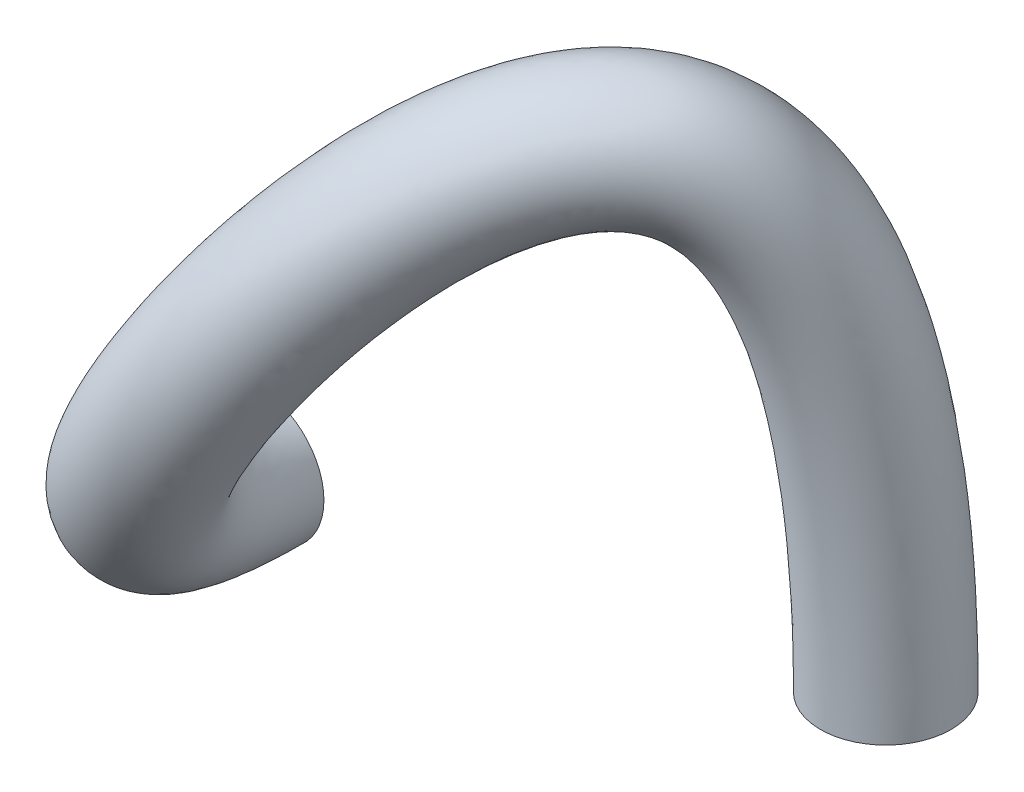
ISO-10303-21;
HEADER;
FILE_DESCRIPTION(('STEP AP214'),'2;1');
FILE_NAME('part.step','',(''),(''),'','','');
FILE_SCHEMA(('AUTOMOTIVE_DESIGN { 1 0 10303 214 1 1 1 1 }'));
ENDSEC;
DATA;
#1=APPLICATION_CONTEXT('core data for automotive mechanical design processes');
#2=APPLICATION_PROTOCOL_DEFINITION('international standard','automotive_design',2000,#1);
#3=PRODUCT_CONTEXT('',#1,'mechanical');
#4=PRODUCT('Part','Part','',(#3));
#5=PRODUCT_RELATED_PRODUCT_CATEGORY('part','',(#4));
#6=PRODUCT_DEFINITION_FORMATION('','',#4);
#7=PRODUCT_DEFINITION_CONTEXT('part definition',#1,'design');
#8=PRODUCT_DEFINITION('design','',#6,#7);
#9=PRODUCT_DEFINITION_SHAPE('','',#8);
#10=(LENGTH_UNIT() NAMED_UNIT(*) SI_UNIT(.MILLI.,.METRE.));
#11=(NAMED_UNIT(*) PLANE_ANGLE_UNIT() SI_UNIT($,.RADIAN.));
#12=(NAMED_UNIT(*) SI_UNIT($,.STERADIAN.) SOLID_ANGLE_UNIT());
#13=UNCERTAINTY_MEASURE_WITH_UNIT(LENGTH_MEASURE(1.E-05),#10,'distance_accuracy_value','');
#14=(GEOMETRIC_REPRESENTATION_CONTEXT(3) GLOBAL_UNCERTAINTY_ASSIGNED_CONTEXT((#13)) GLOBAL_UNIT_ASSIGNED_CONTEXT((#10,
#11,#12)) REPRESENTATION_CONTEXT('',''));
#15=CARTESIAN_POINT('',(0.,0.,0.));
#16=DIRECTION('',(0.,0.,1.));
#17=DIRECTION('',(1.,0.,0.));
#18=AXIS2_PLACEMENT_3D('',#15,#16,#17);
#19=CARTESIAN_POINT('',(9.5,-0.299999999999995,-2.49999999999999));
#20=DIRECTION('',(0.,-1.,0.));
#21=DIRECTION('',(0.435860668457198,0.,0.900014154162058));
#22=AXIS2_PLACEMENT_3D('',#19,#20,#21);
#23=PLANE('',#22);
#24=CARTESIAN_POINT('',(9.5,-0.299999999999995,-2.49999999999999));
#25=DIRECTION('',(0.,-1.,0.));
#26=DIRECTION('',(0.435860668457198,0.,0.900014154162058));
#27=AXIS2_PLACEMENT_3D('',#24,#25,#26);
#28=CIRCLE('',#27,1.);
#29=CARTESIAN_POINT('',(9.93586066845719,-0.299999999999995,-1.59998584583793));
#30=VERTEX_POINT('',#29);
#31=EDGE_CURVE('E373',#30,#30,#28,.T.);
#32=ORIENTED_EDGE('',*,*,#31,.F.);
#33=EDGE_LOOP('',(#32));
#34=FACE_BOUND('',#33,.T.);
#35=CARTESIAN_POINT('',(9.5,-0.299999999999995,-2.49999999999999));
#36=DIRECTION('',(0.,-1.,0.));
#37=DIRECTION('',(0.435860668457198,0.,0.900014154162058));
#38=AXIS2_PLACEMENT_3D('',#35,#36,#37);
#39=CIRCLE('',#38,1.25);
#40=CARTESIAN_POINT('',(10.0448258355715,-0.299999999999995,-1.37498230729742));
#41=VERTEX_POINT('',#40);
#42=EDGE_CURVE('E12',#41,#41,#39,.T.);
#43=ORIENTED_EDGE('',*,*,#42,.T.);
#44=EDGE_LOOP('',(#43));
#45=FACE_BOUND('',#44,.T.);
#46=ADVANCED_FACE('F363',(#34,#45),#23,.T.);
#47=CARTESIAN_POINT('',(0.,0.,0.));
#48=DIRECTION('',(0.,0.,1.));
#49=DIRECTION('',(1.,0.,0.));
#50=AXIS2_PLACEMENT_3D('',#47,#48,#49);
#51=PLANE('',#50);
#52=CARTESIAN_POINT('',(0.,0.,0.));
#53=DIRECTION('',(0.,0.,1.));
#54=DIRECTION('',(1.,0.,0.));
#55=AXIS2_PLACEMENT_3D('',#52,#53,#54);
#56=CIRCLE('',#55,1.);
#57=CARTESIAN_POINT('',(1.,0.,0.));
#58=VERTEX_POINT('',#57);
#59=EDGE_CURVE('E392',#58,#58,#56,.T.);
#60=ORIENTED_EDGE('',*,*,#59,.T.);
#61=EDGE_LOOP('',(#60));
#62=FACE_BOUND('',#61,.T.);
#63=CARTESIAN_POINT('',(0.,0.,0.));
#64=DIRECTION('',(0.,0.,1.));
#65=DIRECTION('',(1.,0.,0.));
#66=AXIS2_PLACEMENT_3D('',#63,#64,#65);
#67=CIRCLE('',#66,1.25);
#68=CARTESIAN_POINT('',(1.25,0.,0.));
#69=VERTEX_POINT('',#68);
#70=EDGE_CURVE('E396',#69,#69,#67,.T.);
#71=ORIENTED_EDGE('',*,*,#70,.F.);
#72=EDGE_LOOP('',(#71));
#73=FACE_BOUND('',#72,.T.);
#74=ADVANCED_FACE('F408',(#62,#73),#51,.F.);
#75=CARTESIAN_POINT('',(1.25,0.,0.));
#76=CARTESIAN_POINT('',(1.24970790337068,-0.00442970995162257,0.193780155677641));
#77=CARTESIAN_POINT('',(1.25956072183078,0.00909482461159728,0.558457921405644));
#78=CARTESIAN_POINT('',(1.29891196332282,0.0804809128516302,1.03069994944278));
#79=CARTESIAN_POINT('',(1.36104166953268,0.19771811780606,1.43692270584782));
#80=CARTESIAN_POINT('',(1.45279667691925,0.371767351783156,1.82348734922537));
#81=CARTESIAN_POINT('',(1.58195449858562,0.615163662315327,2.17950840450404));
#82=CARTESIAN_POINT('',(1.76016188263552,0.945262448393021,2.49952021703322));
#83=CARTESIAN_POINT('',(2.06956449123567,1.50538970272502,2.8675601946024));
#84=CARTESIAN_POINT('',(2.59305886805236,2.41443726349767,3.16848247234639));
#85=CARTESIAN_POINT('',(3.41104303123515,3.72714985596968,3.26574160593447));
#86=CARTESIAN_POINT('',(4.34120833536003,5.11241913369484,3.13949142073032));
#87=CARTESIAN_POINT('',(5.20299741193419,6.294117376404,2.83372957978067));
#88=CARTESIAN_POINT('',(5.94933645553859,7.18019723928193,2.42657665049239));
#89=CARTESIAN_POINT('',(6.57180688229958,7.78557086388303,2.0019254901733));
#90=CARTESIAN_POINT('',(7.11097395414223,8.15960166936673,1.5735169273491));
#91=CARTESIAN_POINT('',(7.56094060980183,8.33675642255061,1.18206758947252));
#92=CARTESIAN_POINT('',(7.92910186187369,8.36889366444584,0.842062655194875));
#93=CARTESIAN_POINT('',(8.26546278110174,8.27496931394701,0.516495861563007));
#94=CARTESIAN_POINT('',(8.5500861514691,8.06658416352015,0.230136076100738));
#95=CARTESIAN_POINT('',(8.79387600969797,7.76984274005819,-0.0217799630494153));
#96=CARTESIAN_POINT('',(8.99724077648749,7.42639308342426,-0.235859805852988));
#97=CARTESIAN_POINT('',(9.19205215628314,6.98450483040624,-0.444215783109933));
#98=CARTESIAN_POINT('',(9.37436994956392,6.43763013462569,-0.641840370690207));
#99=CARTESIAN_POINT('',(9.54056068354409,5.78084656498555,-0.823966280102341));
#100=CARTESIAN_POINT('',(9.75401471178737,4.66114827118732,-1.05984110455954));
#101=CARTESIAN_POINT('',(9.96368412396966,2.81651578889666,-1.29356368532677));
#102=CARTESIAN_POINT('',(10.0369369317042,0.821620233164514,-1.37136536985113));
#103=CARTESIAN_POINT('',(10.0448258355715,-0.3,-1.37498230729743));
#104=CARTESIAN_POINT('',(1.25,-2.5,0.));
#105=CARTESIAN_POINT('',(1.24326949411234,-2.50181298777697,0.284465678298547));
#106=CARTESIAN_POINT('',(1.24024549405577,-2.48305500886445,0.830514489268459));
#107=CARTESIAN_POINT('',(1.28164878753975,-2.35640521686806,1.6210350533056));
#108=CARTESIAN_POINT('',(1.36906171119503,-2.13356525191951,2.36444589003704));
#109=CARTESIAN_POINT('',(1.51887264374403,-1.77764712323755,3.12459053171646));
#110=CARTESIAN_POINT('',(1.74561876096536,-1.26108228048667,3.84848541086706));
#111=CARTESIAN_POINT('',(2.04870855327784,-0.586881492411512,4.47080149910897));
#112=CARTESIAN_POINT('',(2.52263876041138,0.458696762098314,5.12297275854536));
#113=CARTESIAN_POINT('',(3.17450532447572,1.90543280817112,5.56959339553539));
#114=CARTESIAN_POINT('',(3.96286188998503,3.76392804037613,5.72406069441622));
#115=CARTESIAN_POINT('',(4.71806872609749,5.69481341765327,5.56561120964543));
#116=CARTESIAN_POINT('',(5.40553546389612,7.35308661426771,5.10666251364441));
#117=CARTESIAN_POINT('',(6.09693283040277,8.61964756213019,4.4769121236844));
#118=CARTESIAN_POINT('',(6.77673204213036,9.52591798254483,3.80128221697133));
#119=CARTESIAN_POINT('',(7.49582689240253,10.1483627689428,3.0642558034562));
#120=CARTESIAN_POINT('',(8.23478754397491,10.4912127661881,2.29483573104287));
#121=CARTESIAN_POINT('',(8.95791275933525,10.5687596752776,1.52951764450363));
#122=CARTESIAN_POINT('',(9.69554480530046,10.3479044223534,0.731030365550332));
#123=CARTESIAN_POINT('',(10.2929809327123,9.87381572726062,0.0650102769275119));
#124=CARTESIAN_POINT('',(10.7391660034103,9.29484067579996,-0.446464611738695));
#125=CARTESIAN_POINT('',(11.0679515064167,8.70553872313428,-0.832611018337669));
#126=CARTESIAN_POINT('',(11.3477292432485,8.0324778252559,-1.1697592436317));
#127=CARTESIAN_POINT('',(11.5845110661343,7.27815232036638,-1.46290919809448));
#128=CARTESIAN_POINT('',(11.7834520850161,6.43960342234825,-1.71643643009938));
#129=CARTESIAN_POINT('',(12.022466051904,5.09156416509547,-2.03102124779668));
#130=CARTESIAN_POINT('',(12.2343562822196,3.01274304166662,-2.33166525625266));
#131=CARTESIAN_POINT('',(12.293851241391,0.88702931742117,-2.44383367425509));
#132=CARTESIAN_POINT('',(12.2948612209766,-0.299999999999999,-2.46463397844042));
#133=CARTESIAN_POINT('',(-1.25,-2.5,0.));
#134=CARTESIAN_POINT('',(-1.25614631262901,-2.49295356787373,0.326472590329619));
#135=CARTESIAN_POINT('',(-1.2580019261683,-2.45647674915471,0.956535225361718));
#136=CARTESIAN_POINT('',(-1.20430341974557,-2.2806331228024,1.89035039885427));
#137=CARTESIAN_POINT('',(-1.09340096136642,-1.98497698885241,2.78183892657522));
#138=CARTESIAN_POINT('',(-0.903139167127545,-1.5181289196593,3.70028500158813));
#139=CARTESIAN_POINT('',(-0.61580000183354,-0.846044031622846,4.56957072846409));
#140=CARTESIAN_POINT('',(-0.237728493246647,0.0174508212094394,5.29076025993228));
#141=CARTESIAN_POINT('',(0.336970471299427,1.32513626669239,5.99212656325895));
#142=CARTESIAN_POINT('',(1.08035231005068,3.051951199913,6.33867970603329));
#143=CARTESIAN_POINT('',(1.90298858081161,5.12931816943711,6.17575927204351));
#144=CARTESIAN_POINT('',(2.66184987031994,7.14700845506247,5.54379138629021));
#145=CARTESIAN_POINT('',(3.38437492957966,8.76559304408309,4.63536138141749));
#146=CARTESIAN_POINT('',(4.1447320872943,9.96955947334087,3.6763040881749));
#147=CARTESIAN_POINT('',(4.91030943963567,10.8325561739908,2.76230762640708));
#148=CARTESIAN_POINT('',(5.74219410862505,11.4344874324561,1.82340426154238));
#149=CARTESIAN_POINT('',(6.62410722921302,11.756528039735,0.854665361810865));
#150=CARTESIAN_POINT('',(7.50877833528575,11.7849662320469,-0.112946290087902));
#151=CARTESIAN_POINT('',(8.42092112297979,11.4501137790389,-1.12396891402562));
#152=CARTESIAN_POINT('',(9.14761331727424,10.8148738789513,-1.95253356086149));
#153=CARTESIAN_POINT('',(9.67106953957135,10.0785013702174,-2.56871918784365));
#154=CARTESIAN_POINT('',(10.0424290645541,9.35649176576981,-3.01922999948148));
#155=CARTESIAN_POINT('',(10.3450613751276,8.56101247156933,-3.39914912104568));
#156=CARTESIAN_POINT('',(10.5899622781176,7.69828990542811,-3.71853824029694));
#157=CARTESIAN_POINT('',(10.7866573845945,6.76584653026602,-3.98635421162122));
#158=CARTESIAN_POINT('',(11.0121399616626,5.30123805146396,-4.30940390010062));
#159=CARTESIAN_POINT('',(11.1920380342803,3.10556465895813,-4.60340226633559));
#160=CARTESIAN_POINT('',(11.2199773779825,0.91796985651834,-4.70110293455283));
#161=CARTESIAN_POINT('',(11.2052095498336,-0.299999999999999,-4.71466936384557));
#162=CARTESIAN_POINT('',(-1.25,0.,0.));
#163=CARTESIAN_POINT('',(-1.24970790337068,0.0044297099516227,0.235787067708713));
#164=CARTESIAN_POINT('',(-1.23868669839329,0.0356730843213421,0.684478657498903));
#165=CARTESIAN_POINT('',(-1.1870402439625,0.156253006917288,1.30001529499145));
#166=CARTESIAN_POINT('',(-1.10142100302877,0.346306380873162,1.854315742386));
#167=CARTESIAN_POINT('',(-0.969215133952324,0.631285555361405,2.39918181909705));
#168=CARTESIAN_POINT('',(-0.779464264213283,1.03020191117915,2.90059372210108));
#169=CARTESIAN_POINT('',(-0.526275163888964,1.54959476201397,3.31947897785652));
#170=CARTESIAN_POINT('',(-0.116103797876289,2.3718292073191,3.73671399931599));
#171=CARTESIAN_POINT('',(0.498905853627324,3.56095565523954,3.93756878284429));
#172=CARTESIAN_POINT('',(1.35116972206173,5.09253998503065,3.71744018356176));
#173=CARTESIAN_POINT('',(2.28498947958248,6.56461417110404,3.11767159737511));
#174=CARTESIAN_POINT('',(3.18183687761773,7.70662380621938,2.36242844755375));
#175=CARTESIAN_POINT('',(3.99713571243011,8.53010915049262,1.62596861498288));
#176=CARTESIAN_POINT('',(4.70538427980489,9.09220905532896,0.962950899609052));
#177=CARTESIAN_POINT('',(5.35734117036475,9.4457263328801,0.332665385435285));
#178=CARTESIAN_POINT('',(5.95026029503994,9.6020716960975,-0.258102779759483));
#179=CARTESIAN_POINT('',(6.47996743782418,9.5851002212151,-0.800401279396655));
#180=CARTESIAN_POINT('',(6.99083909878106,9.37717867063252,-1.33850341801294));
#181=CARTESIAN_POINT('',(7.40471853603101,9.00764231521084,-1.78740776168826));
#182=CARTESIAN_POINT('',(7.72577954585897,8.55350343447563,-2.14403453915437));
#183=CARTESIAN_POINT('',(7.97171833462486,8.07734612605979,-2.4224787869968));
#184=CARTESIAN_POINT('',(8.18938428816229,7.51303947671967,-2.67360566052391));
#185=CARTESIAN_POINT('',(8.37982116154719,6.85776771968743,-2.89746941289267));
#186=CARTESIAN_POINT('',(8.54376598312256,6.10708967290333,-3.09388406162418));
#187=CARTESIAN_POINT('',(8.74368862154596,4.8708221575558,-3.33822375686348));
#188=CARTESIAN_POINT('',(8.92136587603032,2.90933740618817,-3.5653006954097));
#189=CARTESIAN_POINT('',(8.96306306829577,0.852560772261685,-3.62863463014887));
#190=CARTESIAN_POINT('',(8.9551741644285,-0.3,-3.62501769270257));
#191=CARTESIAN_POINT('',(-1.25,2.5,0.));
#192=CARTESIAN_POINT('',(-1.24326949411234,2.50181298777697,0.145101545087806));
#193=CARTESIAN_POINT('',(-1.21937147061828,2.52782291779739,0.412422089636088));
#194=CARTESIAN_POINT('',(-1.16977706817943,2.59313913663698,0.709680191128635));
#195=CARTESIAN_POINT('',(-1.10944104469112,2.67758975059873,0.92679255819678));
#196=CARTESIAN_POINT('',(-1.0352911007771,2.78070003038211,1.09807863660596));
#197=CARTESIAN_POINT('',(-0.943128526593025,2.90644785398115,1.23161671573806));
#198=CARTESIAN_POINT('',(-0.814821834531281,3.0817387028185,1.34819769578077));
#199=CARTESIAN_POINT('',(-0.569178067052006,3.4185221479458,1.48130143537304));
#200=CARTESIAN_POINT('',(-0.0825406027960343,4.06996011056609,1.5364578596553));
#201=CARTESIAN_POINT('',(0.799350863311849,5.0557618006242,1.25912109508));
#202=CARTESIAN_POINT('',(1.90812908884503,5.98221988714561,0.691551808460004));
#203=CARTESIAN_POINT('',(2.9792988256558,6.64765456835566,0.089495513690001));
#204=CARTESIAN_POINT('',(3.84953933756593,7.09065882764436,-0.42436685820914));
#205=CARTESIAN_POINT('',(4.50045911997411,7.35186193666715,-0.836405827188979));
#206=CARTESIAN_POINT('',(4.97248823210444,7.45696523330408,-1.15807349067181));
#207=CARTESIAN_POINT('',(5.27641336086687,7.44761535246002,-1.37087092132983));
#208=CARTESIAN_POINT('',(5.45115654036262,7.38523421038333,-1.48785626870541));
#209=CARTESIAN_POINT('',(5.56075707458234,7.30424356222608,-1.55303792200026));
#210=CARTESIAN_POINT('',(5.66182375478778,7.20041075147037,-1.62228196251504));
#211=CARTESIAN_POINT('',(5.7804895521466,7.02850549873386,-1.71934989046509));
#212=CARTESIAN_POINT('',(5.90100760469561,6.79820048634977,-1.82572757451212));
#213=CARTESIAN_POINT('',(6.03370720119694,6.46506648187,-1.94806220000214));
#214=CARTESIAN_POINT('',(6.16968004497683,6.01724553394675,-2.07640058548839));
#215=CARTESIAN_POINT('',(6.30087458165058,5.44833281554063,-2.20141391162714));
#216=CARTESIAN_POINT('',(6.47523728142937,4.44040626364765,-2.36704361362634));
#217=CARTESIAN_POINT('',(6.65069371778037,2.71311015341821,-2.52719912448382));
#218=CARTESIAN_POINT('',(6.70614875860903,0.78715168800503,-2.55616632574491));
#219=CARTESIAN_POINT('',(6.70513877902336,-0.300000000000001,-2.53536602155958));
#220=CARTESIAN_POINT('',(1.25,2.5,0.));
#221=CARTESIAN_POINT('',(1.25614631262901,2.49295356787373,0.103094633056735));
#222=CARTESIAN_POINT('',(1.27887594960579,2.50124465808764,0.286401353542829));
#223=CARTESIAN_POINT('',(1.31617513910589,2.51736704257132,0.440364845579962));
#224=CARTESIAN_POINT('',(1.35302162787033,2.52900148753163,0.509399521658595));
#225=CARTESIAN_POINT('',(1.38672071009447,2.52118182680386,0.522384166734286));
#226=CARTESIAN_POINT('',(1.41829023620588,2.49140960511733,0.510531398141029));
#227=CARTESIAN_POINT('',(1.4716152119932,2.47740638919755,0.528238934957466));
#228=CARTESIAN_POINT('',(1.61649022205995,2.55208264335172,0.612147630659443));
#229=CARTESIAN_POINT('',(2.011612411629,2.92344171882421,0.767371549157393));
#230=CARTESIAN_POINT('',(2.85922417248527,3.69037167156322,0.807422517452712));
#231=CARTESIAN_POINT('',(3.96434794462259,4.53002484973641,0.713371631815217));
#232=CARTESIAN_POINT('',(5.00045935997226,5.23514813854028,0.560796645916925));
#233=CARTESIAN_POINT('',(5.80174008067441,5.74074691643368,0.376241177300366));
#234=CARTESIAN_POINT('',(6.3668817224688,6.04522374522122,0.202568763375268));
#235=CARTESIAN_POINT('',(6.72612101588192,6.17084056979072,0.0827780512420079));
#236=CARTESIAN_POINT('',(6.88709367562875,6.18230007891313,0.0692994479021747));
#237=CARTESIAN_POINT('',(6.90029096441212,6.16902765361408,0.154607665886122));
#238=CARTESIAN_POINT('',(6.83538075690301,6.20203420554057,0.301961357575683));
#239=CARTESIAN_POINT('',(6.80719137022587,6.25935259977967,0.395261875273965));
#240=CARTESIAN_POINT('',(6.84858601598559,6.24484480431642,0.402904685639865));
#241=CARTESIAN_POINT('',(6.92653004655825,6.14724744371423,0.360891406631692));
#242=CARTESIAN_POINT('',(7.03637506931779,5.93653183555657,0.281327677411837));
#243=CARTESIAN_POINT('',(7.16422883299355,5.59710794888501,0.179228456714067));
#244=CARTESIAN_POINT('',(7.29766928207211,5.12208970762285,0.0685038698946952));
#245=CARTESIAN_POINT('',(7.48556337167078,4.23073237727916,-0.0886609613223963));
#246=CARTESIAN_POINT('',(7.69301196571971,2.6202885361267,-0.255462114400884));
#247=CARTESIAN_POINT('',(7.78002262201747,0.75621114890786,-0.29889706544717));
#248=CARTESIAN_POINT('',(7.79479045016635,-0.300000000000001,-0.285330636154433));
#249=CARTESIAN_POINT('',(1.25,0.,0.));
#250=CARTESIAN_POINT('',(1.24970790337068,-0.00442970995162257,0.193780155677641));
#251=CARTESIAN_POINT('',(1.25956072183078,0.00909482461159728,0.558457921405644));
#252=CARTESIAN_POINT('',(1.29891196332282,0.0804809128516302,1.03069994944278));
#253=CARTESIAN_POINT('',(1.36104166953268,0.19771811780606,1.43692270584782));
#254=CARTESIAN_POINT('',(1.45279667691925,0.371767351783156,1.82348734922537));
#255=CARTESIAN_POINT('',(1.58195449858562,0.615163662315327,2.17950840450404));
#256=CARTESIAN_POINT('',(1.76016188263552,0.945262448393021,2.49952021703322));
#257=CARTESIAN_POINT('',(2.06956449123567,1.50538970272502,2.8675601946024));
#258=CARTESIAN_POINT('',(2.59305886805236,2.41443726349767,3.16848247234639));
#259=CARTESIAN_POINT('',(3.41104303123515,3.72714985596968,3.26574160593447));
#260=CARTESIAN_POINT('',(4.34120833536003,5.11241913369484,3.13949142073032));
#261=CARTESIAN_POINT('',(5.20299741193419,6.294117376404,2.83372957978067));
#262=CARTESIAN_POINT('',(5.94933645553859,7.18019723928193,2.42657665049239));
#263=CARTESIAN_POINT('',(6.57180688229958,7.78557086388303,2.0019254901733));
#264=CARTESIAN_POINT('',(7.11097395414223,8.15960166936673,1.5735169273491));
#265=CARTESIAN_POINT('',(7.56094060980183,8.33675642255061,1.18206758947252));
#266=CARTESIAN_POINT('',(7.92910186187369,8.36889366444584,0.842062655194875));
#267=CARTESIAN_POINT('',(8.26546278110174,8.27496931394701,0.516495861563007));
#268=CARTESIAN_POINT('',(8.5500861514691,8.06658416352015,0.230136076100738));
#269=CARTESIAN_POINT('',(8.79387600969797,7.76984274005819,-0.0217799630494153));
#270=CARTESIAN_POINT('',(8.99724077648749,7.42639308342426,-0.235859805852988));
#271=CARTESIAN_POINT('',(9.19205215628314,6.98450483040624,-0.444215783109933));
#272=CARTESIAN_POINT('',(9.37436994956392,6.43763013462569,-0.641840370690207));
#273=CARTESIAN_POINT('',(9.54056068354409,5.78084656498555,-0.823966280102341));
#274=CARTESIAN_POINT('',(9.75401471178737,4.66114827118732,-1.05984110455954));
#275=CARTESIAN_POINT('',(9.96368412396966,2.81651578889666,-1.29356368532677));
#276=CARTESIAN_POINT('',(10.0369369317042,0.821620233164514,-1.37136536985113));
#277=CARTESIAN_POINT('',(10.0448258355715,-0.3,-1.37498230729743));
#278=(BOUNDED_SURFACE() B_SPLINE_SURFACE(3,3,((#75,#76,#77,#78,#79,#80,#81,#82,#83,#84,#85,#86,
#87,#88,#89,#90,#91,#92,#93,#94,#95,#96,#97,#98,#99,#100,#101,#102,#103),(#104,#105,#106,#107,
#108,#109,#110,#111,#112,#113,#114,#115,#116,#117,#118,#119,#120,#121,#122,#123,#124,#125,#126,
#127,#128,#129,#130,#131,#132),(#133,#134,#135,#136,#137,#138,#139,#140,#141,#142,#143,#144,
#145,#146,#147,#148,#149,#150,#151,#152,#153,#154,#155,#156,#157,#158,#159,#160,#161),(#162,
#163,#164,#165,#166,#167,#168,#169,#170,#171,#172,#173,#174,#175,#176,#177,#178,#179,#180,#181,
#182,#183,#184,#185,#186,#187,#188,#189,#190),(#191,#192,#193,#194,#195,#196,#197,#198,#199,
#200,#201,#202,#203,#204,#205,#206,#207,#208,#209,#210,#211,#212,#213,#214,#215,#216,#217,#218,
#219),(#220,#221,#222,#223,#224,#225,#226,#227,#228,#229,#230,#231,#232,#233,#234,#235,#236,
#237,#238,#239,#240,#241,#242,#243,#244,#245,#246,#247,#248),(#249,#250,#251,#252,#253,#254,
#255,#256,#257,#258,#259,#260,#261,#262,#263,#264,#265,#266,#267,#268,#269,#270,#271,#272,#273,
#274,#275,#276,#277)),.UNSPECIFIED.,.T.,.F.,.F.) B_SPLINE_SURFACE_WITH_KNOTS((4,3,4),(4,1,1,1,1,
1,1,1,1,1,1,1,1,1,1,1,1,1,1,1,1,1,1,1,1,1,4),(0.,0.5,1.),(0.,0.0234374999999876,0.046875,
0.0703125,0.09375,0.124999999999364,0.156250000000001,0.1875,0.2578125,0.328125,
0.398437500000124,0.468749999999996,0.515625,0.5625,0.609374999999483,0.64453125,0.6796875,
0.71484375,0.75,0.773333333333349,0.796666666666853,0.82,0.843333333333333,0.866666666666667,
0.89,0.945,1.),.UNSPECIFIED.) GEOMETRIC_REPRESENTATION_ITEM() RATIONAL_B_SPLINE_SURFACE(((1.,1.,
1.,1.,1.,1.,1.,1.,1.,1.,1.,1.,1.,1.,1.,1.,1.,1.,1.,1.,1.,1.,1.,1.,1.,1.,1.,1.,1.),
(0.333333333333333,0.333333333333333,0.333333333333333,0.333333333333333,0.333333333333333,
0.333333333333333,0.333333333333333,0.333333333333333,0.333333333333333,0.333333333333333,
0.333333333333333,0.333333333333333,0.333333333333333,0.333333333333333,0.333333333333333,
0.333333333333333,0.333333333333334,0.333333333333333,0.333333333333333,0.333333333333333,
0.333333333333333,0.333333333333333,0.333333333333333,0.333333333333333,0.333333333333333,
0.333333333333333,0.333333333333333,0.333333333333333,0.333333333333333),(0.333333333333333,
0.333333333333333,0.333333333333333,0.333333333333333,0.333333333333333,0.333333333333333,
0.333333333333333,0.333333333333333,0.333333333333333,0.333333333333333,0.333333333333333,
0.333333333333333,0.333333333333333,0.333333333333333,0.333333333333333,0.333333333333333,
0.333333333333334,0.333333333333333,0.333333333333333,0.333333333333333,0.333333333333333,
0.333333333333333,0.333333333333333,0.333333333333333,0.333333333333333,0.333333333333333,
0.333333333333333,0.333333333333333,0.333333333333333),(1.,1.,1.,1.,1.,1.,1.,1.,1.,1.,1.,1.,1.,
1.,1.,1.,1.,1.,1.,1.,1.,1.,1.,1.,1.,1.,1.,1.,1.),(0.333333333333333,0.333333333333333,
0.333333333333333,0.333333333333333,0.333333333333333,0.333333333333333,0.333333333333333,
0.333333333333333,0.333333333333333,0.333333333333333,0.333333333333333,0.333333333333333,
0.333333333333333,0.333333333333333,0.333333333333333,0.333333333333333,0.333333333333334,
0.333333333333333,0.333333333333333,0.333333333333333,0.333333333333333,0.333333333333333,
0.333333333333333,0.333333333333333,0.333333333333333,0.333333333333333,0.333333333333333,
0.333333333333333,0.333333333333333),(0.333333333333333,0.333333333333333,0.333333333333333,
0.333333333333333,0.333333333333333,0.333333333333333,0.333333333333333,0.333333333333333,
0.333333333333333,0.333333333333333,0.333333333333333,0.333333333333333,0.333333333333333,
0.333333333333333,0.333333333333333,0.333333333333333,0.333333333333334,0.333333333333333,
0.333333333333333,0.333333333333333,0.333333333333333,0.333333333333333,0.333333333333333,
0.333333333333333,0.333333333333333,0.333333333333333,0.333333333333333,0.333333333333333,
0.333333333333333),(1.,1.,1.,1.,1.,1.,1.,1.,1.,1.,1.,1.,1.,1.,1.,1.,1.,1.,1.,1.,1.,1.,1.,1.,1.,
1.,1.,1.,1.))) REPRESENTATION_ITEM('') SURFACE());
#279=CARTESIAN_POINT('',(1.25,0.,0.));
#280=CARTESIAN_POINT('',(1.24970790337068,-0.00442970995162257,0.193780155677641));
#281=CARTESIAN_POINT('',(1.25956072183078,0.00909482461159728,0.558457921405644));
#282=CARTESIAN_POINT('',(1.29891196332282,0.0804809128516302,1.03069994944278));
#283=CARTESIAN_POINT('',(1.36104166953268,0.19771811780606,1.43692270584782));
#284=CARTESIAN_POINT('',(1.45279667691925,0.371767351783156,1.82348734922537));
#285=CARTESIAN_POINT('',(1.58195449858562,0.615163662315327,2.17950840450404));
#286=CARTESIAN_POINT('',(1.76016188263552,0.945262448393021,2.49952021703322));
#287=CARTESIAN_POINT('',(2.06956449123567,1.50538970272502,2.8675601946024));
#288=CARTESIAN_POINT('',(2.59305886805236,2.41443726349767,3.16848247234639));
#289=CARTESIAN_POINT('',(3.41104303123515,3.72714985596968,3.26574160593447));
#290=CARTESIAN_POINT('',(4.34120833536003,5.11241913369484,3.13949142073032));
#291=CARTESIAN_POINT('',(5.20299741193419,6.294117376404,2.83372957978067));
#292=CARTESIAN_POINT('',(5.94933645553859,7.18019723928193,2.42657665049239));
#293=CARTESIAN_POINT('',(6.57180688229958,7.78557086388303,2.0019254901733));
#294=CARTESIAN_POINT('',(7.11097395414223,8.15960166936673,1.5735169273491));
#295=CARTESIAN_POINT('',(7.56094060980183,8.33675642255061,1.18206758947252));
#296=CARTESIAN_POINT('',(7.92910186187369,8.36889366444584,0.842062655194875));
#297=CARTESIAN_POINT('',(8.26546278110174,8.27496931394701,0.516495861563007));
#298=CARTESIAN_POINT('',(8.5500861514691,8.06658416352015,0.230136076100738));
#299=CARTESIAN_POINT('',(8.79387600969797,7.76984274005819,-0.0217799630494153));
#300=CARTESIAN_POINT('',(8.99724077648749,7.42639308342426,-0.235859805852988));
#301=CARTESIAN_POINT('',(9.19205215628314,6.98450483040624,-0.444215783109933));
#302=CARTESIAN_POINT('',(9.37436994956392,6.43763013462569,-0.641840370690207));
#303=CARTESIAN_POINT('',(9.54056068354409,5.78084656498555,-0.823966280102341));
#304=CARTESIAN_POINT('',(9.75401471178737,4.66114827118732,-1.05984110455954));
#305=CARTESIAN_POINT('',(9.96368412396966,2.81651578889666,-1.29356368532677));
#306=CARTESIAN_POINT('',(10.0369369317042,0.821620233164514,-1.37136536985113));
#307=CARTESIAN_POINT('',(10.0448258355715,-0.3,-1.37498230729743));
#308=B_SPLINE_CURVE_WITH_KNOTS('',3,(#279,#280,#281,#282,#283,#284,#285,#286,#287,#288,#289,
#290,#291,#292,#293,#294,#295,#296,#297,#298,#299,#300,#301,#302,#303,#304,#305,#306,#307),
.UNSPECIFIED.,.F.,.F.,(4,1,1,1,1,1,1,1,1,1,1,1,1,1,1,1,1,1,1,1,1,1,1,1,1,1,4),(0.,
0.0234374999999876,0.046875,0.0703125,0.09375,0.124999999999364,0.156250000000001,0.1875,
0.2578125,0.328125,0.398437500000124,0.468749999999996,0.515625,0.5625,0.609374999999483,
0.64453125,0.6796875,0.71484375,0.75,0.773333333333349,0.796666666666853,0.82,0.843333333333333,
0.866666666666667,0.89,0.945,1.),.UNSPECIFIED.);
#309=EDGE_CURVE('E366',#69,#41,#308,.T.);
#310=ORIENTED_EDGE('',*,*,#70,.T.);
#311=ORIENTED_EDGE('',*,*,#309,.T.);
#312=ORIENTED_EDGE('',*,*,#42,.F.);
#313=ORIENTED_EDGE('',*,*,#309,.F.);
#314=EDGE_LOOP('',(#310,#311,#312,#313));
#315=FACE_BOUND('',#314,.T.);
#316=ADVANCED_FACE('F406',(#315),#278,.F.);
#317=CARTESIAN_POINT('',(1.,0.,0.));
#318=CARTESIAN_POINT('',(0.999766322696543,-0.00354376796129806,0.197980846880748));
#319=CARTESIAN_POINT('',(1.00973597980837,0.0117526505825718,0.57105999501497));
#320=CARTESIAN_POINT('',(1.05031674259429,0.0880581222581959,1.05763148399765));
#321=CARTESIAN_POINT('',(1.11479540227653,0.21257694411277,1.47866200950164));
#322=CARTESIAN_POINT('',(1.21059549583209,0.397719172140981,1.88105679621254));
#323=CARTESIAN_POINT('',(1.34581262230573,0.656667487201709,2.25161693626375));
#324=CARTESIAN_POINT('',(1.53151817798307,1.00569567975512,2.58151609311555));
#325=CARTESIAN_POINT('',(1.85099766232447,1.59203365318443,2.95447557507376));
#326=CARTESIAN_POINT('',(2.38364356660986,2.52908910267185,3.24539110339618));
#327=CARTESIAN_POINT('',(3.20505570031781,3.86368886887578,3.31091146369719));
#328=CARTESIAN_POINT('',(4.13558644978228,5.25763863743576,3.1373094383948));
#329=CARTESIAN_POINT('',(5.00088135850254,6.43536801938554,2.78659946655798));
#330=CARTESIAN_POINT('',(5.75411638122774,7.315188430403,2.34651584694143));
#331=CARTESIAN_POINT('',(6.38516462205011,7.91623468302762,1.89802803111687));
#332=CARTESIAN_POINT('',(6.93561067576448,8.28821413571807,1.44943177315772));
#333=CARTESIAN_POINT('',(7.39987257832564,8.4632879499053,1.03805055254932));
#334=CARTESIAN_POINT('',(7.78418841946874,8.49051432012277,0.677816261735722));
#335=CARTESIAN_POINT('',(8.13800041286967,8.38519024961556,0.330995933605413));
#336=CARTESIAN_POINT('',(8.43554938992529,8.16068997868921,0.0283816923218383));
#337=CARTESIAN_POINT('',(8.68706636331407,7.84820880949994,-0.234005420659911));
#338=CARTESIAN_POINT('',(8.89468853230123,7.49148838768781,-0.454521703967369));
#339=CARTESIAN_POINT('',(9.09178536947105,7.03735829503758,-0.667154770851331));
#340=CARTESIAN_POINT('',(9.27491507076224,6.47964389313186,-0.867403274910453));
#341=CARTESIAN_POINT('',(9.44088121350194,5.81347087577733,-1.05095805825453));
#342=CARTESIAN_POINT('',(9.65298210276323,4.68211565982417,-1.28767936978993));
#343=CARTESIAN_POINT('',(9.85945229917573,2.82579795062581,-1.52073738633507));
#344=CARTESIAN_POINT('',(9.92954954536337,0.824714287074231,-1.5970922958809));
#345=CARTESIAN_POINT('',(9.9358606684572,-0.3,-1.59998584583794));
#346=CARTESIAN_POINT('',(1.,-2.,0.));
#347=CARTESIAN_POINT('',(0.994615595289875,-2.00145039022158,0.270529264977473));
#348=CARTESIAN_POINT('',(0.994283797588363,-1.98196721619827,0.788705249305222));
#349=CARTESIAN_POINT('',(1.03650620196783,-1.86145078151755,1.5298995670879));
#350=CARTESIAN_POINT('',(1.12121143560641,-1.65244975166769,2.22068055685301));
#351=CARTESIAN_POINT('',(1.26345626929192,-1.32181240787558,2.92193934220541));
#352=CARTESIAN_POINT('',(1.47674403220952,-0.84432926703989,3.58679854135416));
#353=CARTESIAN_POINT('',(1.76235551449693,-0.22001947288851,4.15854111877615));
#354=CARTESIAN_POINT('',(2.21345707766504,0.754679300683063,4.75880562622812));
#355=CARTESIAN_POINT('',(2.84880073174854,2.12188553841062,5.16627984194738));
#356=CARTESIAN_POINT('',(3.64651078731771,3.89311141640094,5.2775667344826));
#357=CARTESIAN_POINT('',(4.43707476237224,5.7235540646025,5.07820526952688));
#358=CARTESIAN_POINT('',(5.16291180007209,7.28254340967651,4.60494581364897));
#359=CARTESIAN_POINT('',(5.87219348111909,8.4667486886816,3.98678422549505));
#360=CARTESIAN_POINT('',(6.54910474991474,9.30851237795706,3.3375134125553));
#361=CARTESIAN_POINT('',(7.24349302637272,9.87922301537889,2.6420228740434));
#362=CARTESIAN_POINT('',(7.9389501256641,10.1868530248153,1.9282650658056));
#363=CARTESIAN_POINT('',(8.60723713743799,10.2504071287882,1.22778025318272));
#364=CARTESIAN_POINT('',(9.28206603222865,10.0435383363407,0.502623536795272));
#365=CARTESIAN_POINT('',(9.82986521491987,9.6064752296816,-0.103718947016743));
#366=CARTESIAN_POINT('',(10.243298358284,9.06820715809335,-0.573753139611335));
#367=CARTESIAN_POINT('',(10.5512571162446,8.51480489945583,-0.931922673955114));
#368=CARTESIAN_POINT('',(10.8163270390433,7.87573669091731,-1.24758953926875));
#369=CARTESIAN_POINT('',(11.0430279640185,7.15206164172441,-1.52425833683387));
#370=CARTESIAN_POINT('',(11.2351943346795,6.34047636166748,-1.76493417825216));
#371=CARTESIAN_POINT('',(11.4677431748565,5.02644837495069,-2.06462348437965));
#372=CARTESIAN_POINT('',(11.6759900257757,2.98277975284178,-2.35121864307578));
#373=CARTESIAN_POINT('',(11.7350809931128,0.877041554479555,-2.45506693940407));
#374=CARTESIAN_POINT('',(11.7358889767813,-0.299999999999999,-2.47170718275234));
#375=CARTESIAN_POINT('',(-1.,-2.,0.));
#376=CARTESIAN_POINT('',(-1.00491705010321,-1.99436285429898,0.304134794602331));
#377=CARTESIAN_POINT('',(-1.00431413859089,-1.96070460843047,0.889521838179829));
#378=CARTESIAN_POINT('',(-0.952255563860423,-1.80083310626503,1.74535184352684));
#379=CARTESIAN_POINT('',(-0.848758702442748,-1.533579141214,2.55459498608356));
#380=CARTESIAN_POINT('',(-0.674153179405343,-1.11419784501298,3.38249491810275));
#381=CARTESIAN_POINT('',(-0.412390978029599,-0.512298667948829,4.16366679543178));
#382=CARTESIAN_POINT('',(-0.0667941227226616,0.263446378008251,4.8145081274348));
#383=CARTESIAN_POINT('',(0.46492244637548,1.44783090435833,5.454128669999));
#384=CARTESIAN_POINT('',(1.17347832020851,3.03910025180412,5.7815488903457));
#385=CARTESIAN_POINT('',(1.99861213997897,4.98542351964972,5.63892559658443));
#386=CARTESIAN_POINT('',(2.7920996777502,6.88531009452986,5.06074941084271));
#387=CARTESIAN_POINT('',(3.54598337261892,8.4125485535288,4.22790490786743));
#388=CARTESIAN_POINT('',(4.31043288663231,9.54667821765015,3.34629779708744));
#389=CARTESIAN_POINT('',(5.05596666791898,10.3538229311138,2.5063337401039));
#390=CARTESIAN_POINT('',(5.84058679935074,10.9081227461896,1.64934164051234));
#391=CARTESIAN_POINT('',(6.65040587385459,11.1991052436528,0.776128770419996));
#392=CARTESIAN_POINT('',(7.44792959819839,11.2233723742036,-0.0861908944904995));
#393=CARTESIAN_POINT('',(8.26236708637211,10.9253058216891,-0.981375886865485));
#394=CARTESIAN_POINT('',(8.9135711225694,10.3593217510342,-1.71775401724794));
#395=CARTESIAN_POINT('',(9.38882118721278,9.6951357136273,-2.2715568004953));
#396=CARTESIAN_POINT('',(9.73083916275451,9.03556733356426,-2.68121785887016));
#397=CARTESIAN_POINT('',(10.0141927445467,8.29856440796806,-3.03110144119993));
#398=CARTESIAN_POINT('',(10.2473889336052,7.4881717097738,-3.32876157059584));
#399=CARTESIAN_POINT('',(10.4377585743423,6.60147084800171,-3.58086840346963));
#400=CARTESIAN_POINT('',(10.6594823026634,5.19418748404548,-3.8873296062228));
#401=CARTESIAN_POINT('',(10.8421354274242,3.05703704667499,-4.16860825114212));
#402=CARTESIAN_POINT('',(10.875981902386,0.901793985757291,-4.26088234764226));
#403=CARTESIAN_POINT('',(10.8641676398669,-0.299999999999999,-4.27173549107645));
#404=CARTESIAN_POINT('',(-1.,0.,0.));
#405=CARTESIAN_POINT('',(-0.999766322696543,0.00354376796129816,0.231586376505605));
#406=CARTESIAN_POINT('',(-0.988861956370884,0.0330152583503677,0.671876583889577));
#407=CARTESIAN_POINT('',(-0.938445023233965,0.148675797510722,1.27308376043659));
#408=CARTESIAN_POINT('',(-0.855174735772628,0.331447554566452,1.81257643873218));
#409=CARTESIAN_POINT('',(-0.727013952865166,0.60533373500358,2.34161237210988));
#410=CARTESIAN_POINT('',(-0.543322387933393,0.98869808629277,2.82848519034137));
#411=CARTESIAN_POINT('',(-0.297631459236515,1.48916153065188,3.23748310177419));
#412=CARTESIAN_POINT('',(0.102463031034906,2.28518525685969,3.64979861884464));
#413=CARTESIAN_POINT('',(0.708321155069828,3.44630381606536,3.8606601517945));
#414=CARTESIAN_POINT('',(1.55715705297907,4.95600097212455,3.67227032579903));
#415=CARTESIAN_POINT('',(2.49061136516024,6.41939466736312,3.11985357971063));
#416=CARTESIAN_POINT('',(3.38395293104938,7.56537316323784,2.40955856077644));
#417=CARTESIAN_POINT('',(4.19235578674096,8.39511795937155,1.70602941853383));
#418=CARTESIAN_POINT('',(4.89202654005436,8.96154523618436,1.06684835866548));
#419=CARTESIAN_POINT('',(5.53270444874249,9.31711386652877,0.456750539626667));
#420=CARTESIAN_POINT('',(6.11132832651613,9.47554016874281,-0.114085742836282));
#421=CARTESIAN_POINT('',(6.62488088022914,9.46347956553817,-0.636154885937502));
#422=CARTESIAN_POINT('',(7.11830146701313,9.26695773496396,-1.15300349005534));
#423=CARTESIAN_POINT('',(7.51925529757482,8.91353650004177,-1.58565337790936));
#424=CARTESIAN_POINT('',(7.83258919224287,8.47513736503389,-1.93180908154388));
#425=CARTESIAN_POINT('',(8.07427057881112,8.01225082179624,-2.20381688888242));
#426=CARTESIAN_POINT('',(8.28965107497437,7.46018601208833,-2.45066667278251));
#427=CARTESIAN_POINT('',(8.47927604034886,6.81575396118125,-2.67190650867242));
#428=CARTESIAN_POINT('',(8.64344545316472,6.07446536211155,-2.866892283472));
#429=CARTESIAN_POINT('',(8.8447212305701,4.84985476891895,-3.11038549163309));
#430=CARTESIAN_POINT('',(9.02559770082426,2.90005524445902,-3.33812699440141));
#431=CARTESIAN_POINT('',(9.07045045463662,0.849466718351968,-3.4029077041191));
#432=CARTESIAN_POINT('',(9.0641393315428,-0.3,-3.40001415416206));
#433=CARTESIAN_POINT('',(-1.,2.,0.));
#434=CARTESIAN_POINT('',(-0.994615595289874,2.00145039022158,0.15903795840888));
#435=CARTESIAN_POINT('',(-0.973409774150874,2.02673512513121,0.454231329599325));
#436=CARTESIAN_POINT('',(-0.924634482607508,2.09818470128647,0.800815677346332));
#437=CARTESIAN_POINT('',(-0.861590769102509,2.19647425034691,1.07055789138081));
#438=CARTESIAN_POINT('',(-0.779874726324988,2.32486531502014,1.30072982611701));
#439=CARTESIAN_POINT('',(-0.674253797837187,2.48969484053437,1.49330358525096));
#440=CARTESIAN_POINT('',(-0.528468795750369,2.7148766832955,1.66045807611359));
#441=CARTESIAN_POINT('',(-0.259996384305667,3.12253960936105,1.84546856769027));
#442=CARTESIAN_POINT('',(0.243163989931141,3.8535073803266,1.9397714132433));
#443=CARTESIAN_POINT('',(1.11570196597917,4.92657842459939,1.70561505501362));
#444=CARTESIAN_POINT('',(2.18912305257028,5.95347924019637,1.17895774857855));
#445=CARTESIAN_POINT('',(3.22192248947983,6.71819777294686,0.591212213685442));
#446=CARTESIAN_POINT('',(4.07427868684961,7.24355770109294,0.0657610399802144));
#447=CARTESIAN_POINT('',(4.72808641218974,7.56926754125492,-0.372637022772948));
#448=CARTESIAN_POINT('',(5.22482209813425,7.72610498686795,-0.73584056125901));
#449=CARTESIAN_POINT('',(5.57225077917767,7.75197509383282,-1.00430025609256));
#450=CARTESIAN_POINT('',(5.80183216225988,7.70358675687276,-1.1861188773845));
#451=CARTESIAN_POINT('',(5.97423584765416,7.60860964823881,-1.3246310932452));
#452=CARTESIAN_POINT('',(6.12493947258023,7.46775124904939,-1.45355273857078));
#453=CARTESIAN_POINT('',(6.27635719727298,7.25513901644047,-1.59206136259245));
#454=CARTESIAN_POINT('',(6.41770199486773,6.98893431002822,-1.72641591889467));
#455=CARTESIAN_POINT('',(6.5651094054021,6.62180761620859,-1.87023190436509));
#456=CARTESIAN_POINT('',(6.71116314709257,6.14333621258871,-2.015051446749));
#457=CARTESIAN_POINT('',(6.84913233198713,5.54745987622139,-2.15291616347437));
#458=CARTESIAN_POINT('',(7.02996015847683,4.50552205379243,-2.33344137704337));
#459=CARTESIAN_POINT('',(7.20905997422429,2.74307344224305,-2.5076457376607));
#460=CARTESIAN_POINT('',(7.26491900688722,0.797139450946644,-2.54493306059593));
#461=CARTESIAN_POINT('',(7.26411102321869,-0.3,-2.52829281724766));
#462=CARTESIAN_POINT('',(1.,2.,0.));
#463=CARTESIAN_POINT('',(1.00491705010321,1.99436285429898,0.125432428784023));
#464=CARTESIAN_POINT('',(1.02518816202838,2.00547251736341,0.353414740724718));
#465=CARTESIAN_POINT('',(1.06412728322075,2.03756702603395,0.585363400907393));
#466=CARTESIAN_POINT('',(1.10837936894665,2.07760363989323,0.736643462150258));
#467=CARTESIAN_POINT('',(1.15773472237227,2.11725075215754,0.840174250219671));
#468=CARTESIAN_POINT('',(1.21488121240193,2.15766424144331,0.916435331173335));
#469=CARTESIAN_POINT('',(1.30068084146922,2.23141083239874,1.00449106745495));
#470=CARTESIAN_POINT('',(1.4885382469839,2.42938800568579,1.15014552391939));
#471=CARTESIAN_POINT('',(1.91848640147117,2.93629266693309,1.32450236484498));
#472=CARTESIAN_POINT('',(2.76360061331791,3.83426632135061,1.34425619291179));
#473=CARTESIAN_POINT('',(3.83409813719232,4.79172321026901,1.19641360726272));
#474=CARTESIAN_POINT('',(4.838850916933,5.58819262909456,0.968253119466982));
#475=CARTESIAN_POINT('',(5.6360392813364,6.1636281721244,0.706247468387819));
#476=CARTESIAN_POINT('',(6.22122449418549,6.52395698809818,0.458542649678449));
#477=CARTESIAN_POINT('',(6.62772832515623,6.69720525605725,0.256840672272045));
#478=CARTESIAN_POINT('',(6.86079503098718,6.73972287499531,0.147836039293044));
#479=CARTESIAN_POINT('',(6.96113970149948,6.73062151145736,0.12785227028872));
#480=CARTESIAN_POINT('',(6.99393479351069,6.72684216289041,0.159368330415553));
#481=CARTESIAN_POINT('',(7.0412335649307,6.71490472769684,0.160482331660419));
#482=CARTESIAN_POINT('',(7.13083436834417,6.62821046090652,0.105742298291514));
#483=CARTESIAN_POINT('',(7.23811994835783,6.46817187591979,0.0228792660203755));
#484=CARTESIAN_POINT('',(7.36724369989878,6.19897989915785,-0.0867200024339147));
#485=CARTESIAN_POINT('',(7.50680217750595,5.80722614453932,-0.210548212987034));
#486=CARTESIAN_POINT('',(7.64656809232435,5.28646538988717,-0.336981938256896));
#487=CARTESIAN_POINT('',(7.83822103066995,4.33778294469764,-0.510735255200219));
#488=CARTESIAN_POINT('',(8.04291457257577,2.66881614840984,-0.690256129594355));
#489=CARTESIAN_POINT('',(8.12401809761398,0.772387019668908,-0.739117652357736));
#490=CARTESIAN_POINT('',(8.13583236013308,-0.300000000000001,-0.728264508923547));
#491=CARTESIAN_POINT('',(1.,0.,0.));
#492=CARTESIAN_POINT('',(0.999766322696543,-0.00354376796129806,0.197980846880748));
#493=CARTESIAN_POINT('',(1.00973597980837,0.0117526505825718,0.57105999501497));
#494=CARTESIAN_POINT('',(1.05031674259429,0.0880581222581959,1.05763148399765));
#495=CARTESIAN_POINT('',(1.11479540227653,0.21257694411277,1.47866200950164));
#496=CARTESIAN_POINT('',(1.21059549583209,0.397719172140981,1.88105679621254));
#497=CARTESIAN_POINT('',(1.34581262230573,0.656667487201709,2.25161693626375));
#498=CARTESIAN_POINT('',(1.53151817798307,1.00569567975512,2.58151609311555));
#499=CARTESIAN_POINT('',(1.85099766232447,1.59203365318443,2.95447557507376));
#500=CARTESIAN_POINT('',(2.38364356660986,2.52908910267185,3.24539110339618));
#501=CARTESIAN_POINT('',(3.20505570031781,3.86368886887578,3.31091146369719));
#502=CARTESIAN_POINT('',(4.13558644978228,5.25763863743576,3.1373094383948));
#503=CARTESIAN_POINT('',(5.00088135850254,6.43536801938554,2.78659946655798));
#504=CARTESIAN_POINT('',(5.75411638122774,7.315188430403,2.34651584694143));
#505=CARTESIAN_POINT('',(6.38516462205011,7.91623468302762,1.89802803111687));
#506=CARTESIAN_POINT('',(6.93561067576448,8.28821413571807,1.44943177315772));
#507=CARTESIAN_POINT('',(7.39987257832564,8.4632879499053,1.03805055254932));
#508=CARTESIAN_POINT('',(7.78418841946874,8.49051432012277,0.677816261735722));
#509=CARTESIAN_POINT('',(8.13800041286967,8.38519024961556,0.330995933605413));
#510=CARTESIAN_POINT('',(8.43554938992529,8.16068997868921,0.0283816923218383));
#511=CARTESIAN_POINT('',(8.68706636331407,7.84820880949994,-0.234005420659911));
#512=CARTESIAN_POINT('',(8.89468853230123,7.49148838768781,-0.454521703967369));
#513=CARTESIAN_POINT('',(9.09178536947105,7.03735829503758,-0.667154770851331));
#514=CARTESIAN_POINT('',(9.27491507076224,6.47964389313186,-0.867403274910453));
#515=CARTESIAN_POINT('',(9.44088121350194,5.81347087577733,-1.05095805825453));
#516=CARTESIAN_POINT('',(9.65298210276323,4.68211565982417,-1.28767936978993));
#517=CARTESIAN_POINT('',(9.85945229917573,2.82579795062581,-1.52073738633507));
#518=CARTESIAN_POINT('',(9.92954954536337,0.824714287074231,-1.5970922958809));
#519=CARTESIAN_POINT('',(9.9358606684572,-0.3,-1.59998584583794));
#520=(BOUNDED_SURFACE() B_SPLINE_SURFACE(3,3,((#317,#318,#319,#320,#321,#322,#323,#324,#325,
#326,#327,#328,#329,#330,#331,#332,#333,#334,#335,#336,#337,#338,#339,#340,#341,#342,#343,#344,
#345),(#346,#347,#348,#349,#350,#351,#352,#353,#354,#355,#356,#357,#358,#359,#360,#361,#362,
#363,#364,#365,#366,#367,#368,#369,#370,#371,#372,#373,#374),(#375,#376,#377,#378,#379,#380,
#381,#382,#383,#384,#385,#386,#387,#388,#389,#390,#391,#392,#393,#394,#395,#396,#397,#398,#399,
#400,#401,#402,#403),(#404,#405,#406,#407,#408,#409,#410,#411,#412,#413,#414,#415,#416,#417,
#418,#419,#420,#421,#422,#423,#424,#425,#426,#427,#428,#429,#430,#431,#432),(#433,#434,#435,
#436,#437,#438,#439,#440,#441,#442,#443,#444,#445,#446,#447,#448,#449,#450,#451,#452,#453,#454,
#455,#456,#457,#458,#459,#460,#461),(#462,#463,#464,#465,#466,#467,#468,#469,#470,#471,#472,
#473,#474,#475,#476,#477,#478,#479,#480,#481,#482,#483,#484,#485,#486,#487,#488,#489,#490),
(#491,#492,#493,#494,#495,#496,#497,#498,#499,#500,#501,#502,#503,#504,#505,#506,#507,#508,#509,
#510,#511,#512,#513,#514,#515,#516,#517,#518,#519)),.UNSPECIFIED.,.T.,.F.,
.F.) B_SPLINE_SURFACE_WITH_KNOTS((4,3,4),(4,1,1,1,1,1,1,1,1,1,1,1,1,1,1,1,1,1,1,1,1,1,1,1,1,1,
4),(0.,0.5,1.),(0.,0.0234374999999876,0.046875,0.0703125,0.09375,0.124999999999364,
0.156250000000001,0.1875,0.2578125,0.328125,0.398437500000124,0.468749999999996,0.515625,0.5625,
0.609374999999483,0.64453125,0.6796875,0.71484375,0.75,0.773333333333349,0.796666666666853,0.82,
0.843333333333333,0.866666666666667,0.89,0.945,1.),
.UNSPECIFIED.) GEOMETRIC_REPRESENTATION_ITEM() RATIONAL_B_SPLINE_SURFACE(((1.,1.,1.,1.,1.,1.,1.,
1.,1.,1.,1.,1.,1.,1.,1.,1.,1.,1.,1.,1.,1.,1.,1.,1.,1.,1.,1.,1.,1.),(0.333333333333333,
0.333333333333333,0.333333333333333,0.333333333333333,0.333333333333333,0.333333333333333,
0.333333333333333,0.333333333333333,0.333333333333333,0.333333333333333,0.333333333333333,
0.333333333333333,0.333333333333333,0.333333333333333,0.333333333333333,0.333333333333333,
0.333333333333334,0.333333333333333,0.333333333333333,0.333333333333333,0.333333333333333,
0.333333333333333,0.333333333333333,0.333333333333333,0.333333333333333,0.333333333333333,
0.333333333333333,0.333333333333333,0.333333333333333),(0.333333333333333,0.333333333333333,
0.333333333333333,0.333333333333333,0.333333333333333,0.333333333333333,0.333333333333333,
0.333333333333333,0.333333333333333,0.333333333333333,0.333333333333333,0.333333333333333,
0.333333333333333,0.333333333333333,0.333333333333333,0.333333333333333,0.333333333333334,
0.333333333333333,0.333333333333333,0.333333333333333,0.333333333333333,0.333333333333333,
0.333333333333333,0.333333333333333,0.333333333333333,0.333333333333333,0.333333333333333,
0.333333333333333,0.333333333333333),(1.,1.,1.,1.,1.,1.,1.,1.,1.,1.,1.,1.,1.,1.,1.,1.,1.,1.,1.,
1.,1.,1.,1.,1.,1.,1.,1.,1.,1.),(0.333333333333333,0.333333333333333,0.333333333333333,
0.333333333333333,0.333333333333333,0.333333333333333,0.333333333333333,0.333333333333333,
0.333333333333333,0.333333333333333,0.333333333333333,0.333333333333333,0.333333333333333,
0.333333333333333,0.333333333333333,0.333333333333333,0.333333333333334,0.333333333333333,
0.333333333333333,0.333333333333333,0.333333333333333,0.333333333333333,0.333333333333333,
0.333333333333333,0.333333333333333,0.333333333333333,0.333333333333333,0.333333333333333,
0.333333333333333),(0.333333333333333,0.333333333333333,0.333333333333333,0.333333333333333,
0.333333333333333,0.333333333333333,0.333333333333333,0.333333333333333,0.333333333333333,
0.333333333333333,0.333333333333333,0.333333333333333,0.333333333333333,0.333333333333333,
0.333333333333333,0.333333333333333,0.333333333333334,0.333333333333333,0.333333333333333,
0.333333333333333,0.333333333333333,0.333333333333333,0.333333333333333,0.333333333333333,
0.333333333333333,0.333333333333333,0.333333333333333,0.333333333333333,0.333333333333333),(1.,
1.,1.,1.,1.,1.,1.,1.,1.,1.,1.,1.,1.,1.,1.,1.,1.,1.,1.,1.,1.,1.,1.,1.,1.,1.,1.,1.,1.))) REPRESENTATION_ITEM('') SURFACE());
#521=CARTESIAN_POINT('',(1.,0.,0.));
#522=CARTESIAN_POINT('',(0.999766322696543,-0.00354376796129806,0.197980846880748));
#523=CARTESIAN_POINT('',(1.00973597980837,0.0117526505825718,0.57105999501497));
#524=CARTESIAN_POINT('',(1.05031674259429,0.0880581222581959,1.05763148399765));
#525=CARTESIAN_POINT('',(1.11479540227653,0.21257694411277,1.47866200950164));
#526=CARTESIAN_POINT('',(1.21059549583209,0.397719172140981,1.88105679621254));
#527=CARTESIAN_POINT('',(1.34581262230573,0.656667487201709,2.25161693626375));
#528=CARTESIAN_POINT('',(1.53151817798307,1.00569567975512,2.58151609311555));
#529=CARTESIAN_POINT('',(1.85099766232447,1.59203365318443,2.95447557507376));
#530=CARTESIAN_POINT('',(2.38364356660986,2.52908910267185,3.24539110339618));
#531=CARTESIAN_POINT('',(3.20505570031781,3.86368886887578,3.31091146369719));
#532=CARTESIAN_POINT('',(4.13558644978228,5.25763863743576,3.1373094383948));
#533=CARTESIAN_POINT('',(5.00088135850254,6.43536801938554,2.78659946655798));
#534=CARTESIAN_POINT('',(5.75411638122774,7.315188430403,2.34651584694143));
#535=CARTESIAN_POINT('',(6.38516462205011,7.91623468302762,1.89802803111687));
#536=CARTESIAN_POINT('',(6.93561067576448,8.28821413571807,1.44943177315772));
#537=CARTESIAN_POINT('',(7.39987257832564,8.4632879499053,1.03805055254932));
#538=CARTESIAN_POINT('',(7.78418841946874,8.49051432012277,0.677816261735722));
#539=CARTESIAN_POINT('',(8.13800041286967,8.38519024961556,0.330995933605413));
#540=CARTESIAN_POINT('',(8.43554938992529,8.16068997868921,0.0283816923218383));
#541=CARTESIAN_POINT('',(8.68706636331407,7.84820880949994,-0.234005420659911));
#542=CARTESIAN_POINT('',(8.89468853230123,7.49148838768781,-0.454521703967369));
#543=CARTESIAN_POINT('',(9.09178536947105,7.03735829503758,-0.667154770851331));
#544=CARTESIAN_POINT('',(9.27491507076224,6.47964389313186,-0.867403274910453));
#545=CARTESIAN_POINT('',(9.44088121350194,5.81347087577733,-1.05095805825453));
#546=CARTESIAN_POINT('',(9.65298210276323,4.68211565982417,-1.28767936978993));
#547=CARTESIAN_POINT('',(9.85945229917573,2.82579795062581,-1.52073738633507));
#548=CARTESIAN_POINT('',(9.92954954536337,0.824714287074231,-1.5970922958809));
#549=CARTESIAN_POINT('',(9.9358606684572,-0.3,-1.59998584583794));
#550=B_SPLINE_CURVE_WITH_KNOTS('',3,(#521,#522,#523,#524,#525,#526,#527,#528,#529,#530,#531,
#532,#533,#534,#535,#536,#537,#538,#539,#540,#541,#542,#543,#544,#545,#546,#547,#548,#549),
.UNSPECIFIED.,.F.,.F.,(4,1,1,1,1,1,1,1,1,1,1,1,1,1,1,1,1,1,1,1,1,1,1,1,1,1,4),(0.,
0.0234374999999876,0.046875,0.0703125,0.09375,0.124999999999364,0.156250000000001,0.1875,
0.2578125,0.328125,0.398437500000124,0.468749999999996,0.515625,0.5625,0.609374999999483,
0.64453125,0.6796875,0.71484375,0.75,0.773333333333349,0.796666666666853,0.82,0.843333333333333,
0.866666666666667,0.89,0.945,1.),.UNSPECIFIED.);
#551=EDGE_CURVE('E394',#58,#30,#550,.T.);
#552=ORIENTED_EDGE('',*,*,#59,.F.);
#553=ORIENTED_EDGE('',*,*,#551,.T.);
#554=ORIENTED_EDGE('',*,*,#31,.T.);
#555=ORIENTED_EDGE('',*,*,#551,.F.);
#556=EDGE_LOOP('',(#552,#553,#554,#555));
#557=FACE_BOUND('',#556,.T.);
#558=ADVANCED_FACE('F393',(#557),#520,.T.);
#559=CLOSED_SHELL('',(#46,#74,#316,#558));
#560=MANIFOLD_SOLID_BREP('B2',#559);
#561=ADVANCED_BREP_SHAPE_REPRESENTATION('',(#18,#560),#14);
#562=SHAPE_DEFINITION_REPRESENTATION(#9,#561);
ENDSEC;
END-ISO-10303-21;
